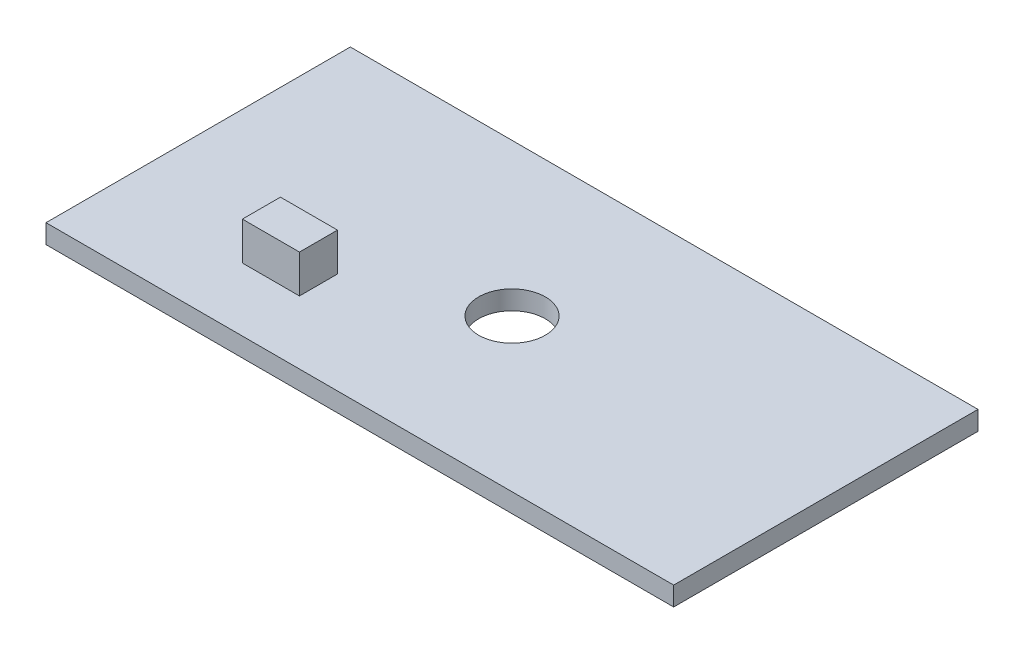
ISO-10303-21;
HEADER;
FILE_DESCRIPTION(('STEP AP214'),'2;1');
FILE_NAME('part.step','',(''),(''),'','','');
FILE_SCHEMA(('AUTOMOTIVE_DESIGN { 1 0 10303 214 1 1 1 1 }'));
ENDSEC;
DATA;
#1=APPLICATION_CONTEXT('core data for automotive mechanical design processes');
#2=APPLICATION_PROTOCOL_DEFINITION('international standard','automotive_design',2000,#1);
#3=PRODUCT_CONTEXT('',#1,'mechanical');
#4=PRODUCT('Part','Part','',(#3));
#5=PRODUCT_RELATED_PRODUCT_CATEGORY('part','',(#4));
#6=PRODUCT_DEFINITION_FORMATION('','',#4);
#7=PRODUCT_DEFINITION_CONTEXT('part definition',#1,'design');
#8=PRODUCT_DEFINITION('design','',#6,#7);
#9=PRODUCT_DEFINITION_SHAPE('','',#8);
#10=(LENGTH_UNIT() NAMED_UNIT(*) SI_UNIT(.MILLI.,.METRE.));
#11=(NAMED_UNIT(*) PLANE_ANGLE_UNIT() SI_UNIT($,.RADIAN.));
#12=(NAMED_UNIT(*) SI_UNIT($,.STERADIAN.) SOLID_ANGLE_UNIT());
#13=UNCERTAINTY_MEASURE_WITH_UNIT(LENGTH_MEASURE(1.E-05),#10,'distance_accuracy_value','');
#14=(GEOMETRIC_REPRESENTATION_CONTEXT(3) GLOBAL_UNCERTAINTY_ASSIGNED_CONTEXT((#13)) GLOBAL_UNIT_ASSIGNED_CONTEXT((#10,
#11,#12)) REPRESENTATION_CONTEXT('',''));
#15=CARTESIAN_POINT('',(0.,0.,0.));
#16=DIRECTION('',(0.,0.,1.));
#17=DIRECTION('',(1.,0.,0.));
#18=AXIS2_PLACEMENT_3D('',#15,#16,#17);
#19=CARTESIAN_POINT('',(0.,1.,0.));
#20=DIRECTION('',(0.,-1.,0.));
#21=DIRECTION('',(0.,0.,-1.));
#22=AXIS2_PLACEMENT_3D('',#19,#20,#21);
#23=PLANE('',#22);
#24=CARTESIAN_POINT('',(-16.5,1.,0.));
#25=DIRECTION('',(0.,1.,0.));
#26=DIRECTION('',(0.,0.,1.));
#27=AXIS2_PLACEMENT_3D('',#24,#25,#26);
#28=CIRCLE('',#27,1.75);
#29=CARTESIAN_POINT('',(-16.5,1.,1.75));
#30=VERTEX_POINT('',#29);
#31=EDGE_CURVE('E132',#30,#30,#28,.T.);
#32=ORIENTED_EDGE('',*,*,#31,.F.);
#33=EDGE_LOOP('',(#32));
#34=FACE_BOUND('',#33,.T.);
#35=DIRECTION('',(0.,0.,-1.));
#36=VECTOR('',#35,1.);
#37=CARTESIAN_POINT('',(0.,1.,-8.));
#38=LINE('',#37,#36);
#39=CARTESIAN_POINT('',(0.,1.,8.));
#40=VERTEX_POINT('',#39);
#41=CARTESIAN_POINT('',(0.,1.,-8.));
#42=VERTEX_POINT('',#41);
#43=EDGE_CURVE('E138',#40,#42,#38,.T.);
#44=ORIENTED_EDGE('',*,*,#43,.T.);
#45=DIRECTION('',(-1.,0.,0.));
#46=VECTOR('',#45,1.);
#47=CARTESIAN_POINT('',(0.,1.,-8.));
#48=LINE('',#47,#46);
#49=CARTESIAN_POINT('',(-33.,1.,-8.00000000000001));
#50=VERTEX_POINT('',#49);
#51=EDGE_CURVE('E141',#42,#50,#48,.T.);
#52=ORIENTED_EDGE('',*,*,#51,.T.);
#53=DIRECTION('',(0.,0.,1.));
#54=VECTOR('',#53,1.);
#55=CARTESIAN_POINT('',(-33.,1.,-8.00000000000001));
#56=LINE('',#55,#54);
#57=CARTESIAN_POINT('',(-33.,1.,8.00000000000001));
#58=VERTEX_POINT('',#57);
#59=EDGE_CURVE('E144',#50,#58,#56,.T.);
#60=ORIENTED_EDGE('',*,*,#59,.T.);
#61=DIRECTION('',(1.,0.,0.));
#62=VECTOR('',#61,1.);
#63=CARTESIAN_POINT('',(0.,1.,8.));
#64=LINE('',#63,#62);
#65=EDGE_CURVE('E146',#58,#40,#64,.T.);
#66=ORIENTED_EDGE('',*,*,#65,.T.);
#67=EDGE_LOOP('',(#44,#52,#60,#66));
#68=FACE_BOUND('',#67,.T.);
#69=DIRECTION('',(0.,0.,1.));
#70=VECTOR('',#69,1.);
#71=CARTESIAN_POINT('',(-26.,1.,0.));
#72=LINE('',#71,#70);
#73=CARTESIAN_POINT('',(-26.,1.,2.67441569803775));
#74=VERTEX_POINT('',#73);
#75=CARTESIAN_POINT('',(-26.,1.,4.67441569803775));
#76=VERTEX_POINT('',#75);
#77=EDGE_CURVE('E119',#74,#76,#72,.T.);
#78=ORIENTED_EDGE('',*,*,#77,.F.);
#79=DIRECTION('',(-1.,0.,0.));
#80=VECTOR('',#79,1.);
#81=CARTESIAN_POINT('',(0.,1.,2.67441569803775));
#82=LINE('',#81,#80);
#83=CARTESIAN_POINT('',(-23.,1.,2.67441569803775));
#84=VERTEX_POINT('',#83);
#85=EDGE_CURVE('E120',#84,#74,#82,.T.);
#86=ORIENTED_EDGE('',*,*,#85,.F.);
#87=DIRECTION('',(0.,0.,-1.));
#88=VECTOR('',#87,1.);
#89=CARTESIAN_POINT('',(-23.,1.,0.));
#90=LINE('',#89,#88);
#91=CARTESIAN_POINT('',(-23.,1.,4.67441569803775));
#92=VERTEX_POINT('',#91);
#93=EDGE_CURVE('E55',#92,#84,#90,.T.);
#94=ORIENTED_EDGE('',*,*,#93,.F.);
#95=DIRECTION('',(1.,0.,0.));
#96=VECTOR('',#95,1.);
#97=CARTESIAN_POINT('',(0.,1.,4.67441569803775));
#98=LINE('',#97,#96);
#99=EDGE_CURVE('E50',#76,#92,#98,.T.);
#100=ORIENTED_EDGE('',*,*,#99,.F.);
#101=EDGE_LOOP('',(#78,#86,#94,#100));
#102=FACE_BOUND('',#101,.T.);
#103=ADVANCED_FACE('F35',(#34,#68,#102),#23,.F.);
#104=CARTESIAN_POINT('',(0.,0.,0.));
#105=DIRECTION('',(0.,-1.,0.));
#106=DIRECTION('',(0.,0.,-1.));
#107=AXIS2_PLACEMENT_3D('',#104,#105,#106);
#108=PLANE('',#107);
#109=DIRECTION('',(0.,0.,-1.));
#110=VECTOR('',#109,1.);
#111=CARTESIAN_POINT('',(0.,0.,-8.));
#112=LINE('',#111,#110);
#113=CARTESIAN_POINT('',(0.,0.,8.));
#114=VERTEX_POINT('',#113);
#115=CARTESIAN_POINT('',(0.,0.,-8.));
#116=VERTEX_POINT('',#115);
#117=EDGE_CURVE('E135',#114,#116,#112,.T.);
#118=ORIENTED_EDGE('',*,*,#117,.F.);
#119=DIRECTION('',(1.,0.,0.));
#120=VECTOR('',#119,1.);
#121=CARTESIAN_POINT('',(0.,0.,8.));
#122=LINE('',#121,#120);
#123=CARTESIAN_POINT('',(-33.,0.,8.00000000000001));
#124=VERTEX_POINT('',#123);
#125=EDGE_CURVE('E142',#124,#114,#122,.T.);
#126=ORIENTED_EDGE('',*,*,#125,.F.);
#127=DIRECTION('',(0.,0.,1.));
#128=VECTOR('',#127,1.);
#129=CARTESIAN_POINT('',(-33.,0.,-8.00000000000001));
#130=LINE('',#129,#128);
#131=CARTESIAN_POINT('',(-33.,0.,-8.00000000000001));
#132=VERTEX_POINT('',#131);
#133=EDGE_CURVE('E153',#132,#124,#130,.T.);
#134=ORIENTED_EDGE('',*,*,#133,.F.);
#135=DIRECTION('',(-1.,0.,0.));
#136=VECTOR('',#135,1.);
#137=CARTESIAN_POINT('',(0.,0.,-8.));
#138=LINE('',#137,#136);
#139=EDGE_CURVE('E151',#116,#132,#138,.T.);
#140=ORIENTED_EDGE('',*,*,#139,.F.);
#141=EDGE_LOOP('',(#118,#126,#134,#140));
#142=FACE_BOUND('',#141,.T.);
#143=CARTESIAN_POINT('',(-16.5,0.,0.));
#144=DIRECTION('',(0.,1.,0.));
#145=DIRECTION('',(0.,0.,1.));
#146=AXIS2_PLACEMENT_3D('',#143,#144,#145);
#147=CIRCLE('',#146,1.75);
#148=CARTESIAN_POINT('',(-16.5,0.,1.75));
#149=VERTEX_POINT('',#148);
#150=EDGE_CURVE('E131',#149,#149,#147,.T.);
#151=ORIENTED_EDGE('',*,*,#150,.T.);
#152=EDGE_LOOP('',(#151));
#153=FACE_BOUND('',#152,.T.);
#154=ADVANCED_FACE('F171',(#142,#153),#108,.T.);
#155=CARTESIAN_POINT('',(0.,1.,-8.));
#156=DIRECTION('',(-1.,0.,0.));
#157=DIRECTION('',(0.,0.,1.));
#158=AXIS2_PLACEMENT_3D('',#155,#156,#157);
#159=PLANE('',#158);
#160=ORIENTED_EDGE('',*,*,#117,.T.);
#161=DIRECTION('',(0.,-1.,0.));
#162=VECTOR('',#161,1.);
#163=CARTESIAN_POINT('',(0.,1.,-8.));
#164=LINE('',#163,#162);
#165=EDGE_CURVE('E11',#42,#116,#164,.T.);
#166=ORIENTED_EDGE('',*,*,#165,.F.);
#167=ORIENTED_EDGE('',*,*,#43,.F.);
#168=DIRECTION('',(0.,-1.,0.));
#169=VECTOR('',#168,1.);
#170=CARTESIAN_POINT('',(0.,1.,8.));
#171=LINE('',#170,#169);
#172=EDGE_CURVE('E148',#40,#114,#171,.T.);
#173=ORIENTED_EDGE('',*,*,#172,.T.);
#174=EDGE_LOOP('',(#160,#166,#167,#173));
#175=FACE_BOUND('',#174,.T.);
#176=ADVANCED_FACE('F37',(#175),#159,.F.);
#177=CARTESIAN_POINT('',(0.,1.,-8.));
#178=DIRECTION('',(0.,0.,1.));
#179=DIRECTION('',(1.,0.,0.));
#180=AXIS2_PLACEMENT_3D('',#177,#178,#179);
#181=PLANE('',#180);
#182=ORIENTED_EDGE('',*,*,#139,.T.);
#183=DIRECTION('',(0.,-1.,0.));
#184=VECTOR('',#183,1.);
#185=CARTESIAN_POINT('',(-33.,1.,-8.00000000000001));
#186=LINE('',#185,#184);
#187=EDGE_CURVE('E43',#50,#132,#186,.T.);
#188=ORIENTED_EDGE('',*,*,#187,.F.);
#189=ORIENTED_EDGE('',*,*,#51,.F.);
#190=ORIENTED_EDGE('',*,*,#165,.T.);
#191=EDGE_LOOP('',(#182,#188,#189,#190));
#192=FACE_BOUND('',#191,.T.);
#193=ADVANCED_FACE('F181',(#192),#181,.F.);
#194=CARTESIAN_POINT('',(-33.,1.,-8.00000000000001));
#195=DIRECTION('',(1.,0.,0.));
#196=DIRECTION('',(0.,0.,-1.));
#197=AXIS2_PLACEMENT_3D('',#194,#195,#196);
#198=PLANE('',#197);
#199=ORIENTED_EDGE('',*,*,#133,.T.);
#200=DIRECTION('',(0.,-1.,0.));
#201=VECTOR('',#200,1.);
#202=CARTESIAN_POINT('',(-33.,1.,8.00000000000001));
#203=LINE('',#202,#201);
#204=EDGE_CURVE('E158',#58,#124,#203,.T.);
#205=ORIENTED_EDGE('',*,*,#204,.F.);
#206=ORIENTED_EDGE('',*,*,#59,.F.);
#207=ORIENTED_EDGE('',*,*,#187,.T.);
#208=EDGE_LOOP('',(#199,#205,#206,#207));
#209=FACE_BOUND('',#208,.T.);
#210=ADVANCED_FACE('F165',(#209),#198,.F.);
#211=CARTESIAN_POINT('',(0.,1.,8.));
#212=DIRECTION('',(0.,0.,-1.));
#213=DIRECTION('',(-1.,0.,0.));
#214=AXIS2_PLACEMENT_3D('',#211,#212,#213);
#215=PLANE('',#214);
#216=ORIENTED_EDGE('',*,*,#125,.T.);
#217=ORIENTED_EDGE('',*,*,#172,.F.);
#218=ORIENTED_EDGE('',*,*,#65,.F.);
#219=ORIENTED_EDGE('',*,*,#204,.T.);
#220=EDGE_LOOP('',(#216,#217,#218,#219));
#221=FACE_BOUND('',#220,.T.);
#222=ADVANCED_FACE('F175',(#221),#215,.F.);
#223=CARTESIAN_POINT('',(-16.5,1.,0.));
#224=DIRECTION('',(0.,-1.,0.));
#225=DIRECTION('',(0.,0.,-1.));
#226=AXIS2_PLACEMENT_3D('',#223,#224,#225);
#227=CYLINDRICAL_SURFACE('',#226,1.75);
#228=ORIENTED_EDGE('',*,*,#31,.T.);
#229=EDGE_LOOP('',(#228));
#230=FACE_BOUND('',#229,.T.);
#231=ORIENTED_EDGE('',*,*,#150,.F.);
#232=EDGE_LOOP('',(#231));
#233=FACE_BOUND('',#232,.T.);
#234=ADVANCED_FACE('F197',(#230,#233),#227,.F.);
#235=CARTESIAN_POINT('',(-26.,3.,4.67441569803775));
#236=DIRECTION('',(1.,0.,0.));
#237=DIRECTION('',(0.,0.,-1.));
#238=AXIS2_PLACEMENT_3D('',#235,#236,#237);
#239=PLANE('',#238);
#240=DIRECTION('',(0.,-1.,0.));
#241=VECTOR('',#240,1.);
#242=CARTESIAN_POINT('',(-26.,3.,2.67441569803775));
#243=LINE('',#242,#241);
#244=CARTESIAN_POINT('',(-26.,3.,2.67441569803775));
#245=VERTEX_POINT('',#244);
#246=EDGE_CURVE('E288',#245,#74,#243,.T.);
#247=ORIENTED_EDGE('',*,*,#246,.T.);
#248=ORIENTED_EDGE('',*,*,#77,.T.);
#249=DIRECTION('',(0.,-1.,0.));
#250=VECTOR('',#249,1.);
#251=CARTESIAN_POINT('',(-26.,3.,4.67441569803775));
#252=LINE('',#251,#250);
#253=CARTESIAN_POINT('',(-26.,3.,4.67441569803775));
#254=VERTEX_POINT('',#253);
#255=EDGE_CURVE('E102',#254,#76,#252,.T.);
#256=ORIENTED_EDGE('',*,*,#255,.F.);
#257=DIRECTION('',(0.,0.,1.));
#258=VECTOR('',#257,1.);
#259=CARTESIAN_POINT('',(-26.,3.,4.67441569803775));
#260=LINE('',#259,#258);
#261=EDGE_CURVE('E108',#245,#254,#260,.T.);
#262=ORIENTED_EDGE('',*,*,#261,.F.);
#263=EDGE_LOOP('',(#247,#248,#256,#262));
#264=FACE_BOUND('',#263,.T.);
#265=ADVANCED_FACE('F118',(#264),#239,.F.);
#266=CARTESIAN_POINT('',(-26.,3.,4.67441569803775));
#267=DIRECTION('',(0.,0.,-1.));
#268=DIRECTION('',(-1.,0.,0.));
#269=AXIS2_PLACEMENT_3D('',#266,#267,#268);
#270=PLANE('',#269);
#271=ORIENTED_EDGE('',*,*,#255,.T.);
#272=ORIENTED_EDGE('',*,*,#99,.T.);
#273=DIRECTION('',(0.,-1.,0.));
#274=VECTOR('',#273,1.);
#275=CARTESIAN_POINT('',(-23.,3.,4.67441569803775));
#276=LINE('',#275,#274);
#277=CARTESIAN_POINT('',(-23.,3.,4.67441569803775));
#278=VERTEX_POINT('',#277);
#279=EDGE_CURVE('E104',#278,#92,#276,.T.);
#280=ORIENTED_EDGE('',*,*,#279,.F.);
#281=DIRECTION('',(1.,0.,0.));
#282=VECTOR('',#281,1.);
#283=CARTESIAN_POINT('',(-26.,3.,4.67441569803775));
#284=LINE('',#283,#282);
#285=EDGE_CURVE('E98',#254,#278,#284,.T.);
#286=ORIENTED_EDGE('',*,*,#285,.F.);
#287=EDGE_LOOP('',(#271,#272,#280,#286));
#288=FACE_BOUND('',#287,.T.);
#289=ADVANCED_FACE('F100',(#288),#270,.F.);
#290=CARTESIAN_POINT('',(-23.,3.,4.67441569803775));
#291=DIRECTION('',(-1.,0.,0.));
#292=DIRECTION('',(0.,0.,1.));
#293=AXIS2_PLACEMENT_3D('',#290,#291,#292);
#294=PLANE('',#293);
#295=ORIENTED_EDGE('',*,*,#279,.T.);
#296=ORIENTED_EDGE('',*,*,#93,.T.);
#297=DIRECTION('',(0.,-1.,0.));
#298=VECTOR('',#297,1.);
#299=CARTESIAN_POINT('',(-23.,3.,2.67441569803775));
#300=LINE('',#299,#298);
#301=CARTESIAN_POINT('',(-23.,3.,2.67441569803775));
#302=VERTEX_POINT('',#301);
#303=EDGE_CURVE('E124',#302,#84,#300,.T.);
#304=ORIENTED_EDGE('',*,*,#303,.F.);
#305=DIRECTION('',(0.,0.,-1.));
#306=VECTOR('',#305,1.);
#307=CARTESIAN_POINT('',(-23.,3.,4.67441569803775));
#308=LINE('',#307,#306);
#309=EDGE_CURVE('E107',#278,#302,#308,.T.);
#310=ORIENTED_EDGE('',*,*,#309,.F.);
#311=EDGE_LOOP('',(#295,#296,#304,#310));
#312=FACE_BOUND('',#311,.T.);
#313=ADVANCED_FACE('F213',(#312),#294,.F.);
#314=CARTESIAN_POINT('',(-26.,3.,2.67441569803775));
#315=DIRECTION('',(0.,0.,1.));
#316=DIRECTION('',(1.,0.,0.));
#317=AXIS2_PLACEMENT_3D('',#314,#315,#316);
#318=PLANE('',#317);
#319=ORIENTED_EDGE('',*,*,#303,.T.);
#320=ORIENTED_EDGE('',*,*,#85,.T.);
#321=ORIENTED_EDGE('',*,*,#246,.F.);
#322=DIRECTION('',(-1.,0.,0.));
#323=VECTOR('',#322,1.);
#324=CARTESIAN_POINT('',(-26.,3.,2.67441569803775));
#325=LINE('',#324,#323);
#326=EDGE_CURVE('E113',#302,#245,#325,.T.);
#327=ORIENTED_EDGE('',*,*,#326,.F.);
#328=EDGE_LOOP('',(#319,#320,#321,#327));
#329=FACE_BOUND('',#328,.T.);
#330=ADVANCED_FACE('F218',(#329),#318,.F.);
#331=CARTESIAN_POINT('',(0.,3.,0.));
#332=DIRECTION('',(0.,-1.,0.));
#333=DIRECTION('',(0.,0.,-1.));
#334=AXIS2_PLACEMENT_3D('',#331,#332,#333);
#335=PLANE('',#334);
#336=ORIENTED_EDGE('',*,*,#261,.T.);
#337=ORIENTED_EDGE('',*,*,#285,.T.);
#338=ORIENTED_EDGE('',*,*,#309,.T.);
#339=ORIENTED_EDGE('',*,*,#326,.T.);
#340=EDGE_LOOP('',(#336,#337,#338,#339));
#341=FACE_BOUND('',#340,.T.);
#342=ADVANCED_FACE('F111',(#341),#335,.F.);
#343=CLOSED_SHELL('',(#103,#154,#176,#193,#210,#222,#234,#265,#289,#313,#330,#342));
#344=MANIFOLD_SOLID_BREP('B2',#343);
#345=ADVANCED_BREP_SHAPE_REPRESENTATION('',(#18,#344),#14);
#346=SHAPE_DEFINITION_REPRESENTATION(#9,#345);
ENDSEC;
END-ISO-10303-21;
